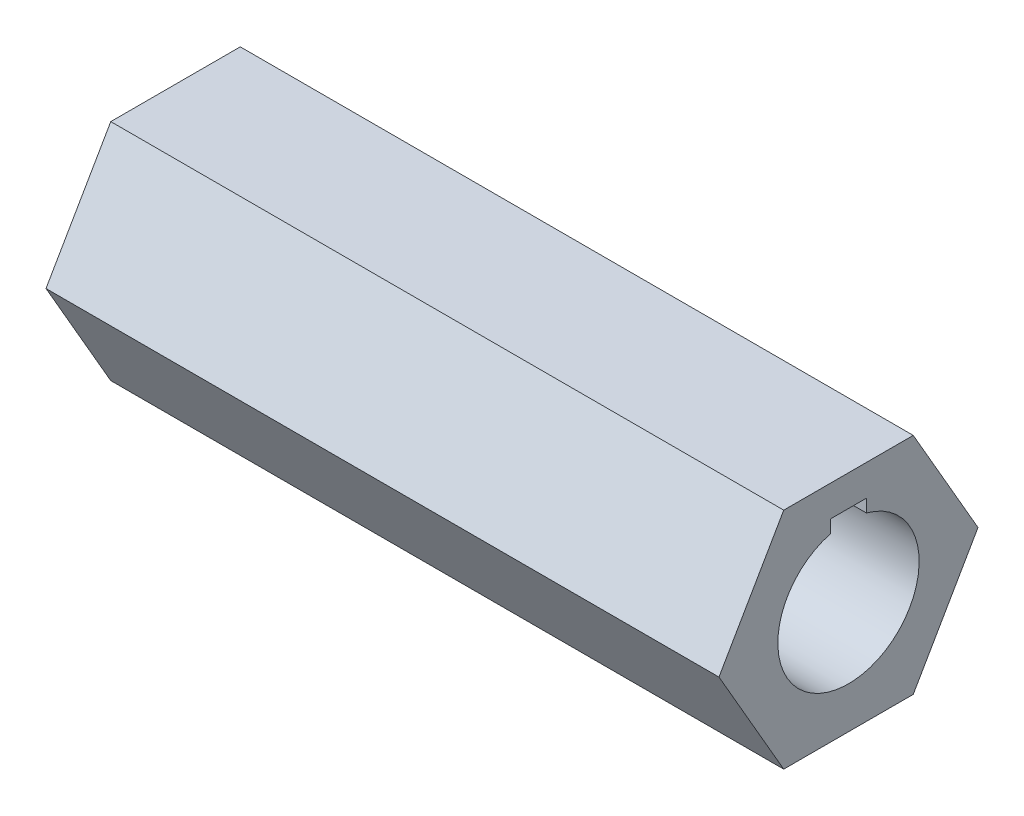
ISO-10303-21;
HEADER;
FILE_DESCRIPTION(('STEP AP214'),'2;1');
FILE_NAME('part.step','',(''),(''),'','','');
FILE_SCHEMA(('AUTOMOTIVE_DESIGN { 1 0 10303 214 1 1 1 1 }'));
ENDSEC;
DATA;
#1=APPLICATION_CONTEXT('core data for automotive mechanical design processes');
#2=APPLICATION_PROTOCOL_DEFINITION('international standard','automotive_design',2000,#1);
#3=PRODUCT_CONTEXT('',#1,'mechanical');
#4=PRODUCT('Part','Part','',(#3));
#5=PRODUCT_RELATED_PRODUCT_CATEGORY('part','',(#4));
#6=PRODUCT_DEFINITION_FORMATION('','',#4);
#7=PRODUCT_DEFINITION_CONTEXT('part definition',#1,'design');
#8=PRODUCT_DEFINITION('design','',#6,#7);
#9=PRODUCT_DEFINITION_SHAPE('','',#8);
#10=(LENGTH_UNIT() NAMED_UNIT(*) SI_UNIT(.MILLI.,.METRE.));
#11=(NAMED_UNIT(*) PLANE_ANGLE_UNIT() SI_UNIT($,.RADIAN.));
#12=(NAMED_UNIT(*) SI_UNIT($,.STERADIAN.) SOLID_ANGLE_UNIT());
#13=UNCERTAINTY_MEASURE_WITH_UNIT(LENGTH_MEASURE(1.E-05),#10,'distance_accuracy_value','');
#14=(GEOMETRIC_REPRESENTATION_CONTEXT(3) GLOBAL_UNCERTAINTY_ASSIGNED_CONTEXT((#13)) GLOBAL_UNIT_ASSIGNED_CONTEXT((#10,
#11,#12)) REPRESENTATION_CONTEXT('',''));
#15=CARTESIAN_POINT('',(0.,0.,0.));
#16=DIRECTION('',(0.,0.,1.));
#17=DIRECTION('',(1.,0.,0.));
#18=AXIS2_PLACEMENT_3D('',#15,#16,#17);
#19=CARTESIAN_POINT('',(38.1,-6.34999999999996,-3.6661742093542));
#20=DIRECTION('',(0.,0.499999999999995,0.866025403784441));
#21=DIRECTION('',(0.,-0.866025403784441,0.499999999999995));
#22=AXIS2_PLACEMENT_3D('',#19,#20,#21);
#23=PLANE('',#22);
#24=DIRECTION('',(0.,0.866025403784441,-0.499999999999995));
#25=VECTOR('',#24,1.);
#26=CARTESIAN_POINT('',(0.,-6.34999999999996,-3.6661742093542));
#27=LINE('',#26,#25);
#28=CARTESIAN_POINT('',(0.,-6.34999999999996,-3.6661742093542));
#29=VERTEX_POINT('',#28);
#30=CARTESIAN_POINT('',(0.,0.,-7.33234841870825));
#31=VERTEX_POINT('',#30);
#32=EDGE_CURVE('E146',#29,#31,#27,.T.);
#33=ORIENTED_EDGE('',*,*,#32,.T.);
#34=DIRECTION('',(-1.,0.,0.));
#35=VECTOR('',#34,1.);
#36=CARTESIAN_POINT('',(38.1,0.,-7.33234841870825));
#37=LINE('',#36,#35);
#38=CARTESIAN_POINT('',(38.1,0.,-7.33234841870825));
#39=VERTEX_POINT('',#38);
#40=EDGE_CURVE('E165',#39,#31,#37,.T.);
#41=ORIENTED_EDGE('',*,*,#40,.F.);
#42=DIRECTION('',(0.,0.866025403784441,-0.499999999999995));
#43=VECTOR('',#42,1.);
#44=CARTESIAN_POINT('',(38.1,-6.34999999999996,-3.6661742093542));
#45=LINE('',#44,#43);
#46=CARTESIAN_POINT('',(38.1,-6.34999999999996,-3.6661742093542));
#47=VERTEX_POINT('',#46);
#48=EDGE_CURVE('E158',#47,#39,#45,.T.);
#49=ORIENTED_EDGE('',*,*,#48,.F.);
#50=DIRECTION('',(-1.,0.,0.));
#51=VECTOR('',#50,1.);
#52=CARTESIAN_POINT('',(38.1,-6.34999999999996,-3.6661742093542));
#53=LINE('',#52,#51);
#54=EDGE_CURVE('E142',#47,#29,#53,.T.);
#55=ORIENTED_EDGE('',*,*,#54,.T.);
#56=EDGE_LOOP('',(#33,#41,#49,#55));
#57=FACE_BOUND('',#56,.T.);
#58=ADVANCED_FACE('F50',(#57),#23,.F.);
#59=CARTESIAN_POINT('',(38.1,0.,-7.33234841870825));
#60=DIRECTION('',(0.,-0.500000000000001,0.866025403784438));
#61=DIRECTION('',(0.,-0.866025403784438,-0.500000000000001));
#62=AXIS2_PLACEMENT_3D('',#59,#60,#61);
#63=PLANE('',#62);
#64=DIRECTION('',(0.,0.866025403784438,0.500000000000001));
#65=VECTOR('',#64,1.);
#66=CARTESIAN_POINT('',(0.,0.,-7.33234841870825));
#67=LINE('',#66,#65);
#68=CARTESIAN_POINT('',(0.,6.35000000000001,-3.66617420935411));
#69=VERTEX_POINT('',#68);
#70=EDGE_CURVE('E149',#31,#69,#67,.T.);
#71=ORIENTED_EDGE('',*,*,#70,.T.);
#72=DIRECTION('',(-1.,0.,0.));
#73=VECTOR('',#72,1.);
#74=CARTESIAN_POINT('',(38.1,6.35000000000001,-3.66617420935411));
#75=LINE('',#74,#73);
#76=CARTESIAN_POINT('',(38.1,6.35000000000001,-3.66617420935411));
#77=VERTEX_POINT('',#76);
#78=EDGE_CURVE('E162',#77,#69,#75,.T.);
#79=ORIENTED_EDGE('',*,*,#78,.F.);
#80=DIRECTION('',(0.,0.866025403784438,0.500000000000001));
#81=VECTOR('',#80,1.);
#82=CARTESIAN_POINT('',(38.1,0.,-7.33234841870825));
#83=LINE('',#82,#81);
#84=EDGE_CURVE('E109',#39,#77,#83,.T.);
#85=ORIENTED_EDGE('',*,*,#84,.F.);
#86=ORIENTED_EDGE('',*,*,#40,.T.);
#87=EDGE_LOOP('',(#71,#79,#85,#86));
#88=FACE_BOUND('',#87,.T.);
#89=ADVANCED_FACE('F194',(#88),#63,.F.);
#90=CARTESIAN_POINT('',(38.1,6.35000000000001,-3.66617420935411));
#91=DIRECTION('',(0.,-1.,0.));
#92=DIRECTION('',(0.,0.,-1.));
#93=AXIS2_PLACEMENT_3D('',#90,#91,#92);
#94=PLANE('',#93);
#95=DIRECTION('',(0.,0.,1.));
#96=VECTOR('',#95,1.);
#97=CARTESIAN_POINT('',(0.,6.35000000000001,-3.66617420935411));
#98=LINE('',#97,#96);
#99=CARTESIAN_POINT('',(0.,6.34999999999999,3.66617420935416));
#100=VERTEX_POINT('',#99);
#101=EDGE_CURVE('E152',#69,#100,#98,.T.);
#102=ORIENTED_EDGE('',*,*,#101,.T.);
#103=DIRECTION('',(-1.,0.,0.));
#104=VECTOR('',#103,1.);
#105=CARTESIAN_POINT('',(38.1,6.34999999999999,3.66617420935416));
#106=LINE('',#105,#104);
#107=CARTESIAN_POINT('',(38.1,6.34999999999999,3.66617420935416));
#108=VERTEX_POINT('',#107);
#109=EDGE_CURVE('E137',#108,#100,#106,.T.);
#110=ORIENTED_EDGE('',*,*,#109,.F.);
#111=DIRECTION('',(0.,0.,1.));
#112=VECTOR('',#111,1.);
#113=CARTESIAN_POINT('',(38.1,6.35000000000001,-3.66617420935411));
#114=LINE('',#113,#112);
#115=EDGE_CURVE('E125',#77,#108,#114,.T.);
#116=ORIENTED_EDGE('',*,*,#115,.F.);
#117=ORIENTED_EDGE('',*,*,#78,.T.);
#118=EDGE_LOOP('',(#102,#110,#116,#117));
#119=FACE_BOUND('',#118,.T.);
#120=ADVANCED_FACE('F197',(#119),#94,.F.);
#121=CARTESIAN_POINT('',(38.1,6.34999999999999,3.66617420935416));
#122=DIRECTION('',(0.,-0.499999999999995,-0.866025403784442));
#123=DIRECTION('',(0.,0.866025403784442,-0.499999999999995));
#124=AXIS2_PLACEMENT_3D('',#121,#122,#123);
#125=PLANE('',#124);
#126=DIRECTION('',(0.,-0.866025403784442,0.499999999999995));
#127=VECTOR('',#126,1.);
#128=CARTESIAN_POINT('',(0.,6.34999999999999,3.66617420935416));
#129=LINE('',#128,#127);
#130=CARTESIAN_POINT('',(0.,0.,7.33234841870825));
#131=VERTEX_POINT('',#130);
#132=EDGE_CURVE('E134',#100,#131,#129,.T.);
#133=ORIENTED_EDGE('',*,*,#132,.T.);
#134=DIRECTION('',(-1.,0.,0.));
#135=VECTOR('',#134,1.);
#136=CARTESIAN_POINT('',(38.1,0.,7.33234841870825));
#137=LINE('',#136,#135);
#138=CARTESIAN_POINT('',(38.1,0.,7.33234841870825));
#139=VERTEX_POINT('',#138);
#140=EDGE_CURVE('E131',#139,#131,#137,.T.);
#141=ORIENTED_EDGE('',*,*,#140,.F.);
#142=DIRECTION('',(0.,-0.866025403784442,0.499999999999995));
#143=VECTOR('',#142,1.);
#144=CARTESIAN_POINT('',(38.1,6.34999999999999,3.66617420935416));
#145=LINE('',#144,#143);
#146=EDGE_CURVE('E118',#108,#139,#145,.T.);
#147=ORIENTED_EDGE('',*,*,#146,.F.);
#148=ORIENTED_EDGE('',*,*,#109,.T.);
#149=EDGE_LOOP('',(#133,#141,#147,#148));
#150=FACE_BOUND('',#149,.T.);
#151=ADVANCED_FACE('F132',(#150),#125,.F.);
#152=CARTESIAN_POINT('',(38.1,0.,7.33234841870825));
#153=DIRECTION('',(0.,0.500000000000007,-0.866025403784435));
#154=DIRECTION('',(0.,0.866025403784434,0.500000000000007));
#155=AXIS2_PLACEMENT_3D('',#152,#153,#154);
#156=PLANE('',#155);
#157=DIRECTION('',(0.,-0.866025403784434,-0.500000000000007));
#158=VECTOR('',#157,1.);
#159=CARTESIAN_POINT('',(0.,0.,7.33234841870825));
#160=LINE('',#159,#158);
#161=CARTESIAN_POINT('',(0.,-6.35000000000004,3.66617420935407));
#162=VERTEX_POINT('',#161);
#163=EDGE_CURVE('E155',#131,#162,#160,.T.);
#164=ORIENTED_EDGE('',*,*,#163,.T.);
#165=DIRECTION('',(-1.,0.,0.));
#166=VECTOR('',#165,1.);
#167=CARTESIAN_POINT('',(38.1,-6.35000000000004,3.66617420935407));
#168=LINE('',#167,#166);
#169=CARTESIAN_POINT('',(38.1,-6.35000000000004,3.66617420935407));
#170=VERTEX_POINT('',#169);
#171=EDGE_CURVE('E138',#170,#162,#168,.T.);
#172=ORIENTED_EDGE('',*,*,#171,.F.);
#173=DIRECTION('',(0.,-0.866025403784434,-0.500000000000007));
#174=VECTOR('',#173,1.);
#175=CARTESIAN_POINT('',(38.1,0.,7.33234841870825));
#176=LINE('',#175,#174);
#177=EDGE_CURVE('E122',#139,#170,#176,.T.);
#178=ORIENTED_EDGE('',*,*,#177,.F.);
#179=ORIENTED_EDGE('',*,*,#140,.T.);
#180=EDGE_LOOP('',(#164,#172,#178,#179));
#181=FACE_BOUND('',#180,.T.);
#182=ADVANCED_FACE('F140',(#181),#156,.F.);
#183=CARTESIAN_POINT('',(38.1,-6.35000000000004,3.66617420935407));
#184=DIRECTION('',(0.,1.,0.));
#185=DIRECTION('',(0.,0.,1.));
#186=AXIS2_PLACEMENT_3D('',#183,#184,#185);
#187=PLANE('',#186);
#188=DIRECTION('',(0.,0.,-1.));
#189=VECTOR('',#188,1.);
#190=CARTESIAN_POINT('',(0.,-6.35000000000004,3.66617420935407));
#191=LINE('',#190,#189);
#192=EDGE_CURVE('E100',#162,#29,#191,.T.);
#193=ORIENTED_EDGE('',*,*,#192,.T.);
#194=ORIENTED_EDGE('',*,*,#54,.F.);
#195=DIRECTION('',(0.,0.,-1.));
#196=VECTOR('',#195,1.);
#197=CARTESIAN_POINT('',(38.1,-6.35000000000004,3.66617420935407));
#198=LINE('',#197,#196);
#199=EDGE_CURVE('E73',#170,#47,#198,.T.);
#200=ORIENTED_EDGE('',*,*,#199,.F.);
#201=ORIENTED_EDGE('',*,*,#171,.T.);
#202=EDGE_LOOP('',(#193,#194,#200,#201));
#203=FACE_BOUND('',#202,.T.);
#204=ADVANCED_FACE('F199',(#203),#187,.F.);
#205=CARTESIAN_POINT('',(38.1,0.,0.));
#206=DIRECTION('',(1.,0.,0.));
#207=DIRECTION('',(0.,0.,-1.));
#208=AXIS2_PLACEMENT_3D('',#205,#206,#207);
#209=PLANE('',#208);
#210=DIRECTION('',(0.,1.,0.));
#211=VECTOR('',#210,1.);
#212=CARTESIAN_POINT('',(38.1,3.4031,1.016));
#213=LINE('',#212,#211);
#214=CARTESIAN_POINT('',(38.1,3.86881687341234,1.016));
#215=VERTEX_POINT('',#214);
#216=CARTESIAN_POINT('',(38.1,4.5969,1.016));
#217=VERTEX_POINT('',#216);
#218=EDGE_CURVE('E247',#215,#217,#213,.T.);
#219=ORIENTED_EDGE('',*,*,#218,.T.);
#220=DIRECTION('',(0.,0.,-1.));
#221=VECTOR('',#220,1.);
#222=CARTESIAN_POINT('',(38.1,4.5969,-1.016));
#223=LINE('',#222,#221);
#224=CARTESIAN_POINT('',(38.1,4.5969,-1.016));
#225=VERTEX_POINT('',#224);
#226=EDGE_CURVE('E242',#217,#225,#223,.T.);
#227=ORIENTED_EDGE('',*,*,#226,.T.);
#228=DIRECTION('',(0.,-1.,0.));
#229=VECTOR('',#228,1.);
#230=CARTESIAN_POINT('',(38.1,3.4031,-1.016));
#231=LINE('',#230,#229);
#232=CARTESIAN_POINT('',(38.1,3.86881687341234,-1.016));
#233=VERTEX_POINT('',#232);
#234=EDGE_CURVE('E236',#225,#233,#231,.T.);
#235=ORIENTED_EDGE('',*,*,#234,.T.);
#236=CARTESIAN_POINT('',(38.1,0.,0.));
#237=DIRECTION('',(1.,0.,0.));
#238=DIRECTION('',(0.,0.,-1.));
#239=AXIS2_PLACEMENT_3D('',#236,#237,#238);
#240=CIRCLE('',#239,4.);
#241=EDGE_CURVE('E173',#215,#233,#240,.T.);
#242=ORIENTED_EDGE('',*,*,#241,.F.);
#243=EDGE_LOOP('',(#219,#227,#235,#242));
#244=FACE_BOUND('',#243,.T.);
#245=ORIENTED_EDGE('',*,*,#48,.T.);
#246=ORIENTED_EDGE('',*,*,#84,.T.);
#247=ORIENTED_EDGE('',*,*,#115,.T.);
#248=ORIENTED_EDGE('',*,*,#146,.T.);
#249=ORIENTED_EDGE('',*,*,#177,.T.);
#250=ORIENTED_EDGE('',*,*,#199,.T.);
#251=EDGE_LOOP('',(#245,#246,#247,#248,#249,#250));
#252=FACE_BOUND('',#251,.T.);
#253=ADVANCED_FACE('F120',(#244,#252),#209,.T.);
#254=CARTESIAN_POINT('',(0.,0.,0.));
#255=DIRECTION('',(1.,0.,0.));
#256=DIRECTION('',(0.,0.,-1.));
#257=AXIS2_PLACEMENT_3D('',#254,#255,#256);
#258=PLANE('',#257);
#259=DIRECTION('',(0.,0.,-1.));
#260=VECTOR('',#259,1.);
#261=CARTESIAN_POINT('',(0.,4.5969,-1.016));
#262=LINE('',#261,#260);
#263=CARTESIAN_POINT('',(0.,4.5969,1.016));
#264=VERTEX_POINT('',#263);
#265=CARTESIAN_POINT('',(0.,4.5969,-1.016));
#266=VERTEX_POINT('',#265);
#267=EDGE_CURVE('E253',#264,#266,#262,.T.);
#268=ORIENTED_EDGE('',*,*,#267,.F.);
#269=DIRECTION('',(0.,1.,0.));
#270=VECTOR('',#269,1.);
#271=CARTESIAN_POINT('',(0.,3.4031,1.016));
#272=LINE('',#271,#270);
#273=CARTESIAN_POINT('',(0.,3.86881687341234,1.016));
#274=VERTEX_POINT('',#273);
#275=EDGE_CURVE('E183',#274,#264,#272,.T.);
#276=ORIENTED_EDGE('',*,*,#275,.F.);
#277=CARTESIAN_POINT('',(0.,0.,0.));
#278=DIRECTION('',(1.,0.,0.));
#279=DIRECTION('',(0.,0.,-1.));
#280=AXIS2_PLACEMENT_3D('',#277,#278,#279);
#281=CIRCLE('',#280,4.);
#282=CARTESIAN_POINT('',(0.,3.86881687341234,-1.016));
#283=VERTEX_POINT('',#282);
#284=EDGE_CURVE('E150',#274,#283,#281,.T.);
#285=ORIENTED_EDGE('',*,*,#284,.T.);
#286=DIRECTION('',(0.,-1.,0.));
#287=VECTOR('',#286,1.);
#288=CARTESIAN_POINT('',(0.,3.4031,-1.016));
#289=LINE('',#288,#287);
#290=EDGE_CURVE('E64',#266,#283,#289,.T.);
#291=ORIENTED_EDGE('',*,*,#290,.F.);
#292=EDGE_LOOP('',(#268,#276,#285,#291));
#293=FACE_BOUND('',#292,.T.);
#294=ORIENTED_EDGE('',*,*,#32,.F.);
#295=ORIENTED_EDGE('',*,*,#192,.F.);
#296=ORIENTED_EDGE('',*,*,#163,.F.);
#297=ORIENTED_EDGE('',*,*,#132,.F.);
#298=ORIENTED_EDGE('',*,*,#101,.F.);
#299=ORIENTED_EDGE('',*,*,#70,.F.);
#300=EDGE_LOOP('',(#294,#295,#296,#297,#298,#299));
#301=FACE_BOUND('',#300,.T.);
#302=ADVANCED_FACE('F179',(#293,#301),#258,.F.);
#303=CARTESIAN_POINT('',(0.,0.,0.));
#304=DIRECTION('',(1.,0.,0.));
#305=DIRECTION('',(0.,0.,-1.));
#306=AXIS2_PLACEMENT_3D('',#303,#304,#305);
#307=CYLINDRICAL_SURFACE('',#306,4.);
#308=ORIENTED_EDGE('',*,*,#284,.F.);
#309=DIRECTION('',(1.,0.,0.));
#310=VECTOR('',#309,1.);
#311=CARTESIAN_POINT('',(0.,3.86881687341233,1.016));
#312=LINE('',#311,#310);
#313=EDGE_CURVE('E13',#274,#215,#312,.T.);
#314=ORIENTED_EDGE('',*,*,#313,.T.);
#315=ORIENTED_EDGE('',*,*,#241,.T.);
#316=DIRECTION('',(1.,0.,0.));
#317=VECTOR('',#316,1.);
#318=CARTESIAN_POINT('',(0.,3.86881687341233,-1.016));
#319=LINE('',#318,#317);
#320=EDGE_CURVE('E57',#233,#283,#319,.F.);
#321=ORIENTED_EDGE('',*,*,#320,.T.);
#322=EDGE_LOOP('',(#308,#314,#315,#321));
#323=FACE_BOUND('',#322,.T.);
#324=ADVANCED_FACE('F170',(#323),#307,.F.);
#325=CARTESIAN_POINT('',(38.1,3.4031,1.016));
#326=DIRECTION('',(0.,0.,1.));
#327=DIRECTION('',(1.,0.,0.));
#328=AXIS2_PLACEMENT_3D('',#325,#326,#327);
#329=PLANE('',#328);
#330=ORIENTED_EDGE('',*,*,#275,.T.);
#331=DIRECTION('',(-1.,0.,0.));
#332=VECTOR('',#331,1.);
#333=CARTESIAN_POINT('',(38.1,4.5969,1.016));
#334=LINE('',#333,#332);
#335=EDGE_CURVE('E188',#217,#264,#334,.T.);
#336=ORIENTED_EDGE('',*,*,#335,.F.);
#337=ORIENTED_EDGE('',*,*,#218,.F.);
#338=ORIENTED_EDGE('',*,*,#313,.F.);
#339=EDGE_LOOP('',(#330,#336,#337,#338));
#340=FACE_BOUND('',#339,.T.);
#341=ADVANCED_FACE('F223',(#340),#329,.F.);
#342=CARTESIAN_POINT('',(38.1,3.4031,-1.016));
#343=DIRECTION('',(0.,0.,-1.));
#344=DIRECTION('',(-1.,0.,0.));
#345=AXIS2_PLACEMENT_3D('',#342,#343,#344);
#346=PLANE('',#345);
#347=ORIENTED_EDGE('',*,*,#234,.F.);
#348=DIRECTION('',(-1.,0.,0.));
#349=VECTOR('',#348,1.);
#350=CARTESIAN_POINT('',(38.1,4.5969,-1.016));
#351=LINE('',#350,#349);
#352=EDGE_CURVE('E185',#225,#266,#351,.T.);
#353=ORIENTED_EDGE('',*,*,#352,.T.);
#354=ORIENTED_EDGE('',*,*,#290,.T.);
#355=ORIENTED_EDGE('',*,*,#320,.F.);
#356=EDGE_LOOP('',(#347,#353,#354,#355));
#357=FACE_BOUND('',#356,.T.);
#358=ADVANCED_FACE('F226',(#357),#346,.F.);
#359=CARTESIAN_POINT('',(38.1,4.5969,-1.016));
#360=DIRECTION('',(0.,1.,0.));
#361=DIRECTION('',(0.,0.,1.));
#362=AXIS2_PLACEMENT_3D('',#359,#360,#361);
#363=PLANE('',#362);
#364=ORIENTED_EDGE('',*,*,#267,.T.);
#365=ORIENTED_EDGE('',*,*,#352,.F.);
#366=ORIENTED_EDGE('',*,*,#226,.F.);
#367=ORIENTED_EDGE('',*,*,#335,.T.);
#368=EDGE_LOOP('',(#364,#365,#366,#367));
#369=FACE_BOUND('',#368,.T.);
#370=ADVANCED_FACE('F228',(#369),#363,.F.);
#371=CLOSED_SHELL('',(#58,#89,#120,#151,#182,#204,#253,#302,#324,#341,#358,#370));
#372=MANIFOLD_SOLID_BREP('B2',#371);
#373=ADVANCED_BREP_SHAPE_REPRESENTATION('',(#18,#372),#14);
#374=SHAPE_DEFINITION_REPRESENTATION(#9,#373);
ENDSEC;
END-ISO-10303-21;
